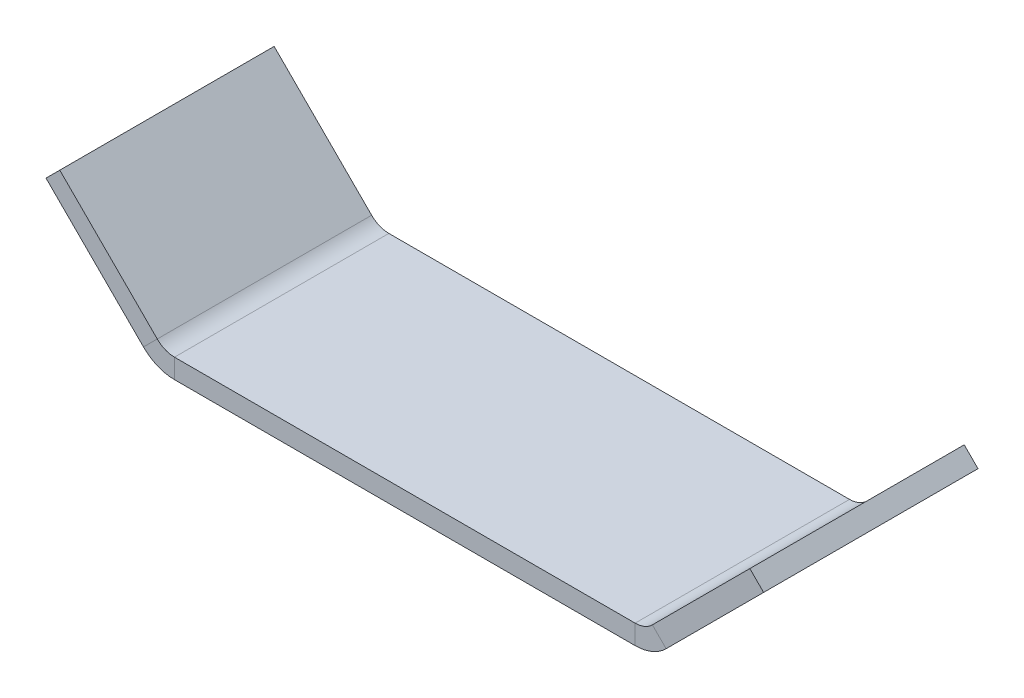
ISO-10303-21;
HEADER;
FILE_DESCRIPTION(('STEP AP214'),'2;1');
FILE_NAME('part.step','',(''),(''),'','','');
FILE_SCHEMA(('AUTOMOTIVE_DESIGN { 1 0 10303 214 1 1 1 1 }'));
ENDSEC;
DATA;
#1=APPLICATION_CONTEXT('core data for automotive mechanical design processes');
#2=APPLICATION_PROTOCOL_DEFINITION('international standard','automotive_design',2000,#1);
#3=PRODUCT_CONTEXT('',#1,'mechanical');
#4=PRODUCT('Part','Part','',(#3));
#5=PRODUCT_RELATED_PRODUCT_CATEGORY('part','',(#4));
#6=PRODUCT_DEFINITION_FORMATION('','',#4);
#7=PRODUCT_DEFINITION_CONTEXT('part definition',#1,'design');
#8=PRODUCT_DEFINITION('design','',#6,#7);
#9=PRODUCT_DEFINITION_SHAPE('','',#8);
#10=(LENGTH_UNIT() NAMED_UNIT(*) SI_UNIT(.MILLI.,.METRE.));
#11=(NAMED_UNIT(*) PLANE_ANGLE_UNIT() SI_UNIT($,.RADIAN.));
#12=(NAMED_UNIT(*) SI_UNIT($,.STERADIAN.) SOLID_ANGLE_UNIT());
#13=UNCERTAINTY_MEASURE_WITH_UNIT(LENGTH_MEASURE(1.E-05),#10,'distance_accuracy_value','');
#14=(GEOMETRIC_REPRESENTATION_CONTEXT(3) GLOBAL_UNCERTAINTY_ASSIGNED_CONTEXT((#13)) GLOBAL_UNIT_ASSIGNED_CONTEXT((#10,
#11,#12)) REPRESENTATION_CONTEXT('',''));
#15=CARTESIAN_POINT('',(0.,0.,0.));
#16=DIRECTION('',(0.,0.,1.));
#17=DIRECTION('',(1.,0.,0.));
#18=AXIS2_PLACEMENT_3D('',#15,#16,#17);
#19=CARTESIAN_POINT('',(-12.0080164940175,0.,11.176));
#20=DIRECTION('',(0.,0.,1.));
#21=DIRECTION('',(1.,0.,0.));
#22=AXIS2_PLACEMENT_3D('',#19,#20,#21);
#23=PLANE('',#22);
#24=DIRECTION('',(0.,-1.,0.));
#25=VECTOR('',#24,1.);
#26=CARTESIAN_POINT('',(-12.0080164940175,0.,11.176));
#27=LINE('',#26,#25);
#28=CARTESIAN_POINT('',(-12.0080164940175,0.,11.176));
#29=VERTEX_POINT('',#28);
#30=CARTESIAN_POINT('',(-12.0080164940175,-1.016,11.176));
#31=VERTEX_POINT('',#30);
#32=EDGE_CURVE('E11',#29,#31,#27,.T.);
#33=ORIENTED_EDGE('',*,*,#32,.F.);
#34=CARTESIAN_POINT('',(-12.0080164940175,1.27,11.176));
#35=DIRECTION('',(0.,0.,-1.));
#36=DIRECTION('',(-1.,0.,0.));
#37=AXIS2_PLACEMENT_3D('',#34,#35,#36);
#38=CIRCLE('',#37,1.27);
#39=CARTESIAN_POINT('',(-12.9060421061244,0.371974387893083,11.176));
#40=VERTEX_POINT('',#39);
#41=EDGE_CURVE('E249',#40,#29,#38,.F.);
#42=ORIENTED_EDGE('',*,*,#41,.F.);
#43=DIRECTION('',(0.707106781186547,0.707106781186548,0.));
#44=VECTOR('',#43,1.);
#45=CARTESIAN_POINT('',(-13.62446259581,-0.346446101792449,11.176));
#46=LINE('',#45,#44);
#47=CARTESIAN_POINT('',(-13.62446259581,-0.346446101792449,11.176));
#48=VERTEX_POINT('',#47);
#49=EDGE_CURVE('E47',#48,#40,#46,.T.);
#50=ORIENTED_EDGE('',*,*,#49,.F.);
#51=CARTESIAN_POINT('',(-12.0080164940175,1.27,11.176));
#52=DIRECTION('',(0.,0.,1.));
#53=DIRECTION('',(1.,0.,0.));
#54=AXIS2_PLACEMENT_3D('',#51,#52,#53);
#55=CIRCLE('',#54,2.286);
#56=EDGE_CURVE('E148',#48,#31,#55,.T.);
#57=ORIENTED_EDGE('',*,*,#56,.T.);
#58=EDGE_LOOP('',(#33,#42,#50,#57));
#59=FACE_BOUND('',#58,.T.);
#60=ADVANCED_FACE('F39',(#59),#23,.T.);
#61=CARTESIAN_POINT('',(-13.62446259581,-0.346446101792449,11.176));
#62=DIRECTION('',(0.,0.,1.));
#63=DIRECTION('',(1.,0.,0.));
#64=AXIS2_PLACEMENT_3D('',#61,#62,#63);
#65=PLANE('',#64);
#66=DIRECTION('',(1.,0.,0.));
#67=VECTOR('',#66,1.);
#68=CARTESIAN_POINT('',(-12.5340677182313,0.,11.176));
#69=LINE('',#68,#67);
#70=CARTESIAN_POINT('',(12.0080164940175,0.,11.176));
#71=VERTEX_POINT('',#70);
#72=EDGE_CURVE('E142',#29,#71,#69,.T.);
#73=ORIENTED_EDGE('',*,*,#72,.F.);
#74=ORIENTED_EDGE('',*,*,#32,.T.);
#75=DIRECTION('',(1.,0.,0.));
#76=VECTOR('',#75,1.);
#77=CARTESIAN_POINT('',(-12.5340677182313,-1.016,11.176));
#78=LINE('',#77,#76);
#79=CARTESIAN_POINT('',(12.0080164940175,-1.016,11.176));
#80=VERTEX_POINT('',#79);
#81=EDGE_CURVE('E139',#31,#80,#78,.T.);
#82=ORIENTED_EDGE('',*,*,#81,.T.);
#83=DIRECTION('',(0.,1.,0.));
#84=VECTOR('',#83,1.);
#85=CARTESIAN_POINT('',(12.0080164940175,-1.016,11.176));
#86=LINE('',#85,#84);
#87=EDGE_CURVE('E230',#80,#71,#86,.T.);
#88=ORIENTED_EDGE('',*,*,#87,.T.);
#89=EDGE_LOOP('',(#73,#74,#82,#88));
#90=FACE_BOUND('',#89,.T.);
#91=ADVANCED_FACE('F137',(#90),#65,.T.);
#92=CARTESIAN_POINT('',(-12.9060421061244,0.371974387893083,0.));
#93=DIRECTION('',(0.,0.,-1.));
#94=DIRECTION('',(-1.,0.,0.));
#95=AXIS2_PLACEMENT_3D('',#92,#93,#94);
#96=PLANE('',#95);
#97=DIRECTION('',(-0.707106781186547,-0.707106781186548,0.));
#98=VECTOR('',#97,1.);
#99=CARTESIAN_POINT('',(-12.9060421061244,0.371974387893083,0.));
#100=LINE('',#99,#98);
#101=CARTESIAN_POINT('',(-12.9060421061244,0.371974387893083,0.));
#102=VERTEX_POINT('',#101);
#103=CARTESIAN_POINT('',(-13.62446259581,-0.346446101792449,0.));
#104=VERTEX_POINT('',#103);
#105=EDGE_CURVE('E235',#102,#104,#100,.T.);
#106=ORIENTED_EDGE('',*,*,#105,.F.);
#107=CARTESIAN_POINT('',(-12.0080164940175,1.27,0.));
#108=DIRECTION('',(0.,0.,-1.));
#109=DIRECTION('',(-1.,0.,0.));
#110=AXIS2_PLACEMENT_3D('',#107,#108,#109);
#111=CIRCLE('',#110,1.27);
#112=CARTESIAN_POINT('',(-12.0080164940175,0.,0.));
#113=VERTEX_POINT('',#112);
#114=EDGE_CURVE('E187',#102,#113,#111,.F.);
#115=ORIENTED_EDGE('',*,*,#114,.T.);
#116=DIRECTION('',(0.,1.,0.));
#117=VECTOR('',#116,1.);
#118=CARTESIAN_POINT('',(-12.0080164940175,-1.016,0.));
#119=LINE('',#118,#117);
#120=CARTESIAN_POINT('',(-12.0080164940175,-1.016,0.));
#121=VERTEX_POINT('',#120);
#122=EDGE_CURVE('E233',#121,#113,#119,.T.);
#123=ORIENTED_EDGE('',*,*,#122,.F.);
#124=CARTESIAN_POINT('',(-12.0080164940175,1.27,0.));
#125=DIRECTION('',(0.,0.,1.));
#126=DIRECTION('',(1.,0.,0.));
#127=AXIS2_PLACEMENT_3D('',#124,#125,#126);
#128=CIRCLE('',#127,2.286);
#129=EDGE_CURVE('E160',#104,#121,#128,.T.);
#130=ORIENTED_EDGE('',*,*,#129,.F.);
#131=EDGE_LOOP('',(#106,#115,#123,#130));
#132=FACE_BOUND('',#131,.T.);
#133=ADVANCED_FACE('F287',(#132),#96,.T.);
#134=CARTESIAN_POINT('',(-12.0080164940175,-1.016,0.));
#135=DIRECTION('',(0.,0.,-1.));
#136=DIRECTION('',(-1.,0.,0.));
#137=AXIS2_PLACEMENT_3D('',#134,#135,#136);
#138=PLANE('',#137);
#139=DIRECTION('',(0.707106781186549,-0.707106781186546,0.));
#140=VECTOR('',#139,1.);
#141=CARTESIAN_POINT('',(-12.5340677182313,0.,0.));
#142=LINE('',#141,#140);
#143=CARTESIAN_POINT('',(-17.9878223742557,5.45375465602433,0.));
#144=VERTEX_POINT('',#143);
#145=EDGE_CURVE('E190',#144,#102,#142,.T.);
#146=ORIENTED_EDGE('',*,*,#145,.T.);
#147=ORIENTED_EDGE('',*,*,#105,.T.);
#148=DIRECTION('',(0.707106781186549,-0.707106781186546,0.));
#149=VECTOR('',#148,1.);
#150=CARTESIAN_POINT('',(-13.2524882079169,-0.718420489685533,0.));
#151=LINE('',#150,#149);
#152=CARTESIAN_POINT('',(-18.7062428639412,4.7353341663388,0.));
#153=VERTEX_POINT('',#152);
#154=EDGE_CURVE('E196',#153,#104,#151,.T.);
#155=ORIENTED_EDGE('',*,*,#154,.F.);
#156=DIRECTION('',(0.707106781186548,0.707106781186548,0.));
#157=VECTOR('',#156,1.);
#158=CARTESIAN_POINT('',(-18.7062428639412,4.7353341663388,0.));
#159=LINE('',#158,#157);
#160=EDGE_CURVE('E193',#153,#144,#159,.T.);
#161=ORIENTED_EDGE('',*,*,#160,.T.);
#162=EDGE_LOOP('',(#146,#147,#155,#161));
#163=FACE_BOUND('',#162,.T.);
#164=ADVANCED_FACE('F290',(#163),#138,.T.);
#165=CARTESIAN_POINT('',(12.9060421061244,0.371974387893082,11.176));
#166=DIRECTION('',(0.,0.,1.));
#167=DIRECTION('',(1.,0.,0.));
#168=AXIS2_PLACEMENT_3D('',#165,#166,#167);
#169=PLANE('',#168);
#170=DIRECTION('',(0.707106781186548,-0.707106781186547,0.));
#171=VECTOR('',#170,1.);
#172=CARTESIAN_POINT('',(12.9060421061244,0.371974387893082,11.176));
#173=LINE('',#172,#171);
#174=CARTESIAN_POINT('',(12.9060421061244,0.371974387893082,11.176));
#175=VERTEX_POINT('',#174);
#176=CARTESIAN_POINT('',(13.62446259581,-0.346446101792449,11.176));
#177=VERTEX_POINT('',#176);
#178=EDGE_CURVE('E55',#175,#177,#173,.T.);
#179=ORIENTED_EDGE('',*,*,#178,.F.);
#180=CARTESIAN_POINT('',(12.0080164940175,1.27,11.176));
#181=DIRECTION('',(0.,0.,-1.));
#182=DIRECTION('',(-1.,0.,0.));
#183=AXIS2_PLACEMENT_3D('',#180,#181,#182);
#184=CIRCLE('',#183,1.27);
#185=EDGE_CURVE('E259',#71,#175,#184,.F.);
#186=ORIENTED_EDGE('',*,*,#185,.F.);
#187=ORIENTED_EDGE('',*,*,#87,.F.);
#188=CARTESIAN_POINT('',(12.0080164940175,1.27,11.176));
#189=DIRECTION('',(0.,0.,1.));
#190=DIRECTION('',(1.,0.,0.));
#191=AXIS2_PLACEMENT_3D('',#188,#189,#190);
#192=CIRCLE('',#191,2.286);
#193=EDGE_CURVE('E168',#80,#177,#192,.T.);
#194=ORIENTED_EDGE('',*,*,#193,.T.);
#195=EDGE_LOOP('',(#179,#186,#187,#194));
#196=FACE_BOUND('',#195,.T.);
#197=ADVANCED_FACE('F282',(#196),#169,.T.);
#198=CARTESIAN_POINT('',(12.0080164940175,-1.016,11.176));
#199=DIRECTION('',(0.,0.,1.));
#200=DIRECTION('',(1.,0.,0.));
#201=AXIS2_PLACEMENT_3D('',#198,#199,#200);
#202=PLANE('',#201);
#203=DIRECTION('',(0.707106781186546,0.707106781186549,0.));
#204=VECTOR('',#203,1.);
#205=CARTESIAN_POINT('',(12.5340677182313,0.,11.176));
#206=LINE('',#205,#204);
#207=CARTESIAN_POINT('',(17.9878223742557,5.45375465602433,11.176));
#208=VERTEX_POINT('',#207);
#209=EDGE_CURVE('E262',#175,#208,#206,.T.);
#210=ORIENTED_EDGE('',*,*,#209,.F.);
#211=ORIENTED_EDGE('',*,*,#178,.T.);
#212=DIRECTION('',(0.707106781186546,0.707106781186549,0.));
#213=VECTOR('',#212,1.);
#214=CARTESIAN_POINT('',(13.2524882079169,-0.718420489685531,11.176));
#215=LINE('',#214,#213);
#216=CARTESIAN_POINT('',(18.7062428639412,4.7353341663388,11.176));
#217=VERTEX_POINT('',#216);
#218=EDGE_CURVE('E109',#177,#217,#215,.T.);
#219=ORIENTED_EDGE('',*,*,#218,.T.);
#220=DIRECTION('',(0.707106781186549,-0.707106781186546,0.));
#221=VECTOR('',#220,1.);
#222=CARTESIAN_POINT('',(17.9878223742557,5.45375465602433,11.176));
#223=LINE('',#222,#221);
#224=EDGE_CURVE('E265',#208,#217,#223,.T.);
#225=ORIENTED_EDGE('',*,*,#224,.F.);
#226=EDGE_LOOP('',(#210,#211,#219,#225));
#227=FACE_BOUND('',#226,.T.);
#228=ADVANCED_FACE('F271',(#227),#202,.T.);
#229=CARTESIAN_POINT('',(12.0080164940175,0.,0.));
#230=DIRECTION('',(0.,0.,-1.));
#231=DIRECTION('',(-1.,0.,0.));
#232=AXIS2_PLACEMENT_3D('',#229,#230,#231);
#233=PLANE('',#232);
#234=DIRECTION('',(0.,-1.,0.));
#235=VECTOR('',#234,1.);
#236=CARTESIAN_POINT('',(12.0080164940175,0.,0.));
#237=LINE('',#236,#235);
#238=CARTESIAN_POINT('',(12.0080164940175,0.,0.));
#239=VERTEX_POINT('',#238);
#240=CARTESIAN_POINT('',(12.0080164940175,-1.016,0.));
#241=VERTEX_POINT('',#240);
#242=EDGE_CURVE('E96',#239,#241,#237,.T.);
#243=ORIENTED_EDGE('',*,*,#242,.F.);
#244=CARTESIAN_POINT('',(12.0080164940175,1.27,0.));
#245=DIRECTION('',(0.,0.,-1.));
#246=DIRECTION('',(-1.,0.,0.));
#247=AXIS2_PLACEMENT_3D('',#244,#245,#246);
#248=CIRCLE('',#247,1.27);
#249=CARTESIAN_POINT('',(12.9060421061244,0.371974387893082,0.));
#250=VERTEX_POINT('',#249);
#251=EDGE_CURVE('E183',#239,#250,#248,.F.);
#252=ORIENTED_EDGE('',*,*,#251,.T.);
#253=DIRECTION('',(-0.707106781186548,0.707106781186547,0.));
#254=VECTOR('',#253,1.);
#255=CARTESIAN_POINT('',(13.62446259581,-0.346446101792449,0.));
#256=LINE('',#255,#254);
#257=CARTESIAN_POINT('',(13.62446259581,-0.346446101792449,0.));
#258=VERTEX_POINT('',#257);
#259=EDGE_CURVE('E103',#258,#250,#256,.T.);
#260=ORIENTED_EDGE('',*,*,#259,.F.);
#261=CARTESIAN_POINT('',(12.0080164940175,1.27,0.));
#262=DIRECTION('',(0.,0.,1.));
#263=DIRECTION('',(1.,0.,0.));
#264=AXIS2_PLACEMENT_3D('',#261,#262,#263);
#265=CIRCLE('',#264,2.286);
#266=EDGE_CURVE('E202',#241,#258,#265,.T.);
#267=ORIENTED_EDGE('',*,*,#266,.F.);
#268=EDGE_LOOP('',(#243,#252,#260,#267));
#269=FACE_BOUND('',#268,.T.);
#270=ADVANCED_FACE('F319',(#269),#233,.T.);
#271=CARTESIAN_POINT('',(13.62446259581,-0.346446101792449,0.));
#272=DIRECTION('',(0.,0.,-1.));
#273=DIRECTION('',(-1.,0.,0.));
#274=AXIS2_PLACEMENT_3D('',#271,#272,#273);
#275=PLANE('',#274);
#276=DIRECTION('',(1.,0.,0.));
#277=VECTOR('',#276,1.);
#278=CARTESIAN_POINT('',(-12.5340677182313,0.,0.));
#279=LINE('',#278,#277);
#280=EDGE_CURVE('E185',#113,#239,#279,.T.);
#281=ORIENTED_EDGE('',*,*,#280,.T.);
#282=ORIENTED_EDGE('',*,*,#242,.T.);
#283=DIRECTION('',(1.,0.,0.));
#284=VECTOR('',#283,1.);
#285=CARTESIAN_POINT('',(-12.5340677182313,-1.016,0.));
#286=LINE('',#285,#284);
#287=EDGE_CURVE('E200',#121,#241,#286,.T.);
#288=ORIENTED_EDGE('',*,*,#287,.F.);
#289=ORIENTED_EDGE('',*,*,#122,.T.);
#290=EDGE_LOOP('',(#281,#282,#288,#289));
#291=FACE_BOUND('',#290,.T.);
#292=ADVANCED_FACE('F322',(#291),#275,.T.);
#293=CARTESIAN_POINT('',(13.2524882079169,-0.718420489685531,11.176));
#294=DIRECTION('',(-0.707106781186549,0.707106781186546,0.));
#295=DIRECTION('',(-0.707106781186546,-0.707106781186549,0.));
#296=AXIS2_PLACEMENT_3D('',#293,#294,#295);
#297=PLANE('',#296);
#298=DIRECTION('',(0.707106781186546,0.707106781186549,0.));
#299=VECTOR('',#298,1.);
#300=CARTESIAN_POINT('',(13.2524882079169,-0.718420489685531,0.));
#301=LINE('',#300,#299);
#302=CARTESIAN_POINT('',(18.7062428639412,4.7353341663388,0.));
#303=VERTEX_POINT('',#302);
#304=EDGE_CURVE('E174',#258,#303,#301,.T.);
#305=ORIENTED_EDGE('',*,*,#304,.T.);
#306=DIRECTION('',(0.,0.,-1.));
#307=VECTOR('',#306,1.);
#308=CARTESIAN_POINT('',(18.7062428639412,4.7353341663388,11.176));
#309=LINE('',#308,#307);
#310=EDGE_CURVE('E226',#217,#303,#309,.T.);
#311=ORIENTED_EDGE('',*,*,#310,.F.);
#312=ORIENTED_EDGE('',*,*,#218,.F.);
#313=DIRECTION('',(0.,0.,-1.));
#314=VECTOR('',#313,1.);
#315=CARTESIAN_POINT('',(13.62446259581,-0.346446101792449,11.176));
#316=LINE('',#315,#314);
#317=EDGE_CURVE('E170',#177,#258,#316,.T.);
#318=ORIENTED_EDGE('',*,*,#317,.T.);
#319=EDGE_LOOP('',(#305,#311,#312,#318));
#320=FACE_BOUND('',#319,.T.);
#321=ADVANCED_FACE('F325',(#320),#297,.F.);
#322=CARTESIAN_POINT('',(17.9878223742557,5.45375465602433,11.176));
#323=DIRECTION('',(0.707106781186546,0.707106781186549,0.));
#324=DIRECTION('',(-0.707106781186549,0.707106781186546,0.));
#325=AXIS2_PLACEMENT_3D('',#322,#323,#324);
#326=PLANE('',#325);
#327=DIRECTION('',(0.707106781186549,-0.707106781186546,0.));
#328=VECTOR('',#327,1.);
#329=CARTESIAN_POINT('',(17.9878223742557,5.45375465602433,0.));
#330=LINE('',#329,#328);
#331=CARTESIAN_POINT('',(17.9878223742557,5.45375465602433,0.));
#332=VERTEX_POINT('',#331);
#333=EDGE_CURVE('E177',#332,#303,#330,.T.);
#334=ORIENTED_EDGE('',*,*,#333,.F.);
#335=DIRECTION('',(0.,0.,-1.));
#336=VECTOR('',#335,1.);
#337=CARTESIAN_POINT('',(17.9878223742557,5.45375465602433,11.176));
#338=LINE('',#337,#336);
#339=EDGE_CURVE('E224',#208,#332,#338,.T.);
#340=ORIENTED_EDGE('',*,*,#339,.F.);
#341=ORIENTED_EDGE('',*,*,#224,.T.);
#342=ORIENTED_EDGE('',*,*,#310,.T.);
#343=EDGE_LOOP('',(#334,#340,#341,#342));
#344=FACE_BOUND('',#343,.T.);
#345=ADVANCED_FACE('F270',(#344),#326,.T.);
#346=CARTESIAN_POINT('',(12.5340677182313,0.,11.176));
#347=DIRECTION('',(-0.707106781186549,0.707106781186546,0.));
#348=DIRECTION('',(-0.707106781186546,-0.707106781186549,0.));
#349=AXIS2_PLACEMENT_3D('',#346,#347,#348);
#350=PLANE('',#349);
#351=DIRECTION('',(0.707106781186546,0.707106781186549,0.));
#352=VECTOR('',#351,1.);
#353=CARTESIAN_POINT('',(12.5340677182313,0.,0.));
#354=LINE('',#353,#352);
#355=EDGE_CURVE('E180',#250,#332,#354,.T.);
#356=ORIENTED_EDGE('',*,*,#355,.F.);
#357=DIRECTION('',(0.,0.,-1.));
#358=VECTOR('',#357,1.);
#359=CARTESIAN_POINT('',(12.9060421061244,0.371974387893082,11.176));
#360=LINE('',#359,#358);
#361=EDGE_CURVE('E221',#175,#250,#360,.T.);
#362=ORIENTED_EDGE('',*,*,#361,.F.);
#363=ORIENTED_EDGE('',*,*,#209,.T.);
#364=ORIENTED_EDGE('',*,*,#339,.T.);
#365=EDGE_LOOP('',(#356,#362,#363,#364));
#366=FACE_BOUND('',#365,.T.);
#367=ADVANCED_FACE('F275',(#366),#350,.T.);
#368=CARTESIAN_POINT('',(12.0080164940175,1.27,11.176));
#369=DIRECTION('',(0.,0.,-1.));
#370=DIRECTION('',(-1.,0.,0.));
#371=AXIS2_PLACEMENT_3D('',#368,#369,#370);
#372=CYLINDRICAL_SURFACE('',#371,1.27);
#373=ORIENTED_EDGE('',*,*,#251,.F.);
#374=DIRECTION('',(0.,0.,-1.));
#375=VECTOR('',#374,1.);
#376=CARTESIAN_POINT('',(12.0080164940175,0.,11.176));
#377=LINE('',#376,#375);
#378=EDGE_CURVE('E218',#71,#239,#377,.T.);
#379=ORIENTED_EDGE('',*,*,#378,.F.);
#380=ORIENTED_EDGE('',*,*,#185,.T.);
#381=ORIENTED_EDGE('',*,*,#361,.T.);
#382=EDGE_LOOP('',(#373,#379,#380,#381));
#383=FACE_BOUND('',#382,.T.);
#384=ADVANCED_FACE('F278',(#383),#372,.F.);
#385=CARTESIAN_POINT('',(-12.5340677182313,0.,11.176));
#386=DIRECTION('',(0.,1.,0.));
#387=DIRECTION('',(0.,0.,1.));
#388=AXIS2_PLACEMENT_3D('',#385,#386,#387);
#389=PLANE('',#388);
#390=ORIENTED_EDGE('',*,*,#280,.F.);
#391=DIRECTION('',(0.,0.,-1.));
#392=VECTOR('',#391,1.);
#393=CARTESIAN_POINT('',(-12.0080164940175,0.,11.176));
#394=LINE('',#393,#392);
#395=EDGE_CURVE('E215',#29,#113,#394,.T.);
#396=ORIENTED_EDGE('',*,*,#395,.F.);
#397=ORIENTED_EDGE('',*,*,#72,.T.);
#398=ORIENTED_EDGE('',*,*,#378,.T.);
#399=EDGE_LOOP('',(#390,#396,#397,#398));
#400=FACE_BOUND('',#399,.T.);
#401=ADVANCED_FACE('F285',(#400),#389,.T.);
#402=CARTESIAN_POINT('',(-12.0080164940175,1.27,11.176));
#403=DIRECTION('',(0.,0.,-1.));
#404=DIRECTION('',(-1.,0.,0.));
#405=AXIS2_PLACEMENT_3D('',#402,#403,#404);
#406=CYLINDRICAL_SURFACE('',#405,1.27);
#407=ORIENTED_EDGE('',*,*,#114,.F.);
#408=DIRECTION('',(0.,0.,-1.));
#409=VECTOR('',#408,1.);
#410=CARTESIAN_POINT('',(-12.9060421061244,0.371974387893083,11.176));
#411=LINE('',#410,#409);
#412=EDGE_CURVE('E212',#40,#102,#411,.T.);
#413=ORIENTED_EDGE('',*,*,#412,.F.);
#414=ORIENTED_EDGE('',*,*,#41,.T.);
#415=ORIENTED_EDGE('',*,*,#395,.T.);
#416=EDGE_LOOP('',(#407,#413,#414,#415));
#417=FACE_BOUND('',#416,.T.);
#418=ADVANCED_FACE('F248',(#417),#406,.F.);
#419=CARTESIAN_POINT('',(-12.5340677182313,0.,11.176));
#420=DIRECTION('',(0.707106781186547,0.707106781186549,0.));
#421=DIRECTION('',(-0.707106781186549,0.707106781186546,0.));
#422=AXIS2_PLACEMENT_3D('',#419,#420,#421);
#423=PLANE('',#422);
#424=ORIENTED_EDGE('',*,*,#145,.F.);
#425=DIRECTION('',(0.,0.,-1.));
#426=VECTOR('',#425,1.);
#427=CARTESIAN_POINT('',(-17.9878223742557,5.45375465602433,11.176));
#428=LINE('',#427,#426);
#429=CARTESIAN_POINT('',(-17.9878223742557,5.45375465602433,11.176));
#430=VERTEX_POINT('',#429);
#431=EDGE_CURVE('E210',#430,#144,#428,.T.);
#432=ORIENTED_EDGE('',*,*,#431,.F.);
#433=DIRECTION('',(0.707106781186549,-0.707106781186546,0.));
#434=VECTOR('',#433,1.);
#435=CARTESIAN_POINT('',(-12.5340677182313,0.,11.176));
#436=LINE('',#435,#434);
#437=EDGE_CURVE('E242',#430,#40,#436,.T.);
#438=ORIENTED_EDGE('',*,*,#437,.T.);
#439=ORIENTED_EDGE('',*,*,#412,.T.);
#440=EDGE_LOOP('',(#424,#432,#438,#439));
#441=FACE_BOUND('',#440,.T.);
#442=ADVANCED_FACE('F253',(#441),#423,.T.);
#443=CARTESIAN_POINT('',(-18.7062428639412,4.7353341663388,11.176));
#444=DIRECTION('',(-0.707106781186548,0.707106781186548,0.));
#445=DIRECTION('',(-0.707106781186548,-0.707106781186548,0.));
#446=AXIS2_PLACEMENT_3D('',#443,#444,#445);
#447=PLANE('',#446);
#448=ORIENTED_EDGE('',*,*,#160,.F.);
#449=DIRECTION('',(0.,0.,-1.));
#450=VECTOR('',#449,1.);
#451=CARTESIAN_POINT('',(-18.7062428639412,4.7353341663388,11.176));
#452=LINE('',#451,#450);
#453=CARTESIAN_POINT('',(-18.7062428639412,4.7353341663388,11.176));
#454=VERTEX_POINT('',#453);
#455=EDGE_CURVE('E208',#454,#153,#452,.T.);
#456=ORIENTED_EDGE('',*,*,#455,.F.);
#457=DIRECTION('',(0.707106781186548,0.707106781186548,0.));
#458=VECTOR('',#457,1.);
#459=CARTESIAN_POINT('',(-18.7062428639412,4.7353341663388,11.176));
#460=LINE('',#459,#458);
#461=EDGE_CURVE('E254',#454,#430,#460,.T.);
#462=ORIENTED_EDGE('',*,*,#461,.T.);
#463=ORIENTED_EDGE('',*,*,#431,.T.);
#464=EDGE_LOOP('',(#448,#456,#462,#463));
#465=FACE_BOUND('',#464,.T.);
#466=ADVANCED_FACE('F295',(#465),#447,.T.);
#467=CARTESIAN_POINT('',(-13.2524882079169,-0.718420489685533,11.176));
#468=DIRECTION('',(0.707106781186546,0.707106781186549,0.));
#469=DIRECTION('',(-0.707106781186549,0.707106781186546,0.));
#470=AXIS2_PLACEMENT_3D('',#467,#468,#469);
#471=PLANE('',#470);
#472=ORIENTED_EDGE('',*,*,#154,.T.);
#473=DIRECTION('',(0.,0.,-1.));
#474=VECTOR('',#473,1.);
#475=CARTESIAN_POINT('',(-13.62446259581,-0.346446101792449,11.176));
#476=LINE('',#475,#474);
#477=EDGE_CURVE('E162',#48,#104,#476,.T.);
#478=ORIENTED_EDGE('',*,*,#477,.F.);
#479=DIRECTION('',(0.707106781186549,-0.707106781186546,0.));
#480=VECTOR('',#479,1.);
#481=CARTESIAN_POINT('',(-13.2524882079169,-0.718420489685533,11.176));
#482=LINE('',#481,#480);
#483=EDGE_CURVE('E153',#454,#48,#482,.T.);
#484=ORIENTED_EDGE('',*,*,#483,.F.);
#485=ORIENTED_EDGE('',*,*,#455,.T.);
#486=EDGE_LOOP('',(#472,#478,#484,#485));
#487=FACE_BOUND('',#486,.T.);
#488=ADVANCED_FACE('F293',(#487),#471,.F.);
#489=CARTESIAN_POINT('',(-12.0080164940175,1.27,11.176));
#490=DIRECTION('',(0.,0.,-1.));
#491=DIRECTION('',(-1.,0.,0.));
#492=AXIS2_PLACEMENT_3D('',#489,#490,#491);
#493=CYLINDRICAL_SURFACE('',#492,2.286);
#494=ORIENTED_EDGE('',*,*,#129,.T.);
#495=DIRECTION('',(0.,0.,-1.));
#496=VECTOR('',#495,1.);
#497=CARTESIAN_POINT('',(-12.0080164940175,-1.016,11.176));
#498=LINE('',#497,#496);
#499=EDGE_CURVE('E157',#31,#121,#498,.T.);
#500=ORIENTED_EDGE('',*,*,#499,.F.);
#501=ORIENTED_EDGE('',*,*,#56,.F.);
#502=ORIENTED_EDGE('',*,*,#477,.T.);
#503=EDGE_LOOP('',(#494,#500,#501,#502));
#504=FACE_BOUND('',#503,.T.);
#505=ADVANCED_FACE('F158',(#504),#493,.T.);
#506=CARTESIAN_POINT('',(-12.5340677182313,-1.016,11.176));
#507=DIRECTION('',(0.,1.,0.));
#508=DIRECTION('',(0.,0.,1.));
#509=AXIS2_PLACEMENT_3D('',#506,#507,#508);
#510=PLANE('',#509);
#511=ORIENTED_EDGE('',*,*,#287,.T.);
#512=DIRECTION('',(0.,0.,-1.));
#513=VECTOR('',#512,1.);
#514=CARTESIAN_POINT('',(12.0080164940175,-1.016,11.176));
#515=LINE('',#514,#513);
#516=EDGE_CURVE('E163',#80,#241,#515,.T.);
#517=ORIENTED_EDGE('',*,*,#516,.F.);
#518=ORIENTED_EDGE('',*,*,#81,.F.);
#519=ORIENTED_EDGE('',*,*,#499,.T.);
#520=EDGE_LOOP('',(#511,#517,#518,#519));
#521=FACE_BOUND('',#520,.T.);
#522=ADVANCED_FACE('F165',(#521),#510,.F.);
#523=CARTESIAN_POINT('',(12.0080164940175,1.27,11.176));
#524=DIRECTION('',(0.,0.,-1.));
#525=DIRECTION('',(-1.,0.,0.));
#526=AXIS2_PLACEMENT_3D('',#523,#524,#525);
#527=CYLINDRICAL_SURFACE('',#526,2.286);
#528=ORIENTED_EDGE('',*,*,#266,.T.);
#529=ORIENTED_EDGE('',*,*,#317,.F.);
#530=ORIENTED_EDGE('',*,*,#193,.F.);
#531=ORIENTED_EDGE('',*,*,#516,.T.);
#532=EDGE_LOOP('',(#528,#529,#530,#531));
#533=FACE_BOUND('',#532,.T.);
#534=ADVANCED_FACE('F377',(#533),#527,.T.);
#535=CARTESIAN_POINT('',(12.0080164940175,1.27,11.176));
#536=DIRECTION('',(0.,0.,-1.));
#537=DIRECTION('',(-1.,0.,0.));
#538=AXIS2_PLACEMENT_3D('',#535,#536,#537);
#539=PLANE('',#538);
#540=ORIENTED_EDGE('',*,*,#483,.T.);
#541=ORIENTED_EDGE('',*,*,#49,.T.);
#542=ORIENTED_EDGE('',*,*,#437,.F.);
#543=ORIENTED_EDGE('',*,*,#461,.F.);
#544=EDGE_LOOP('',(#540,#541,#542,#543));
#545=FACE_BOUND('',#544,.T.);
#546=ADVANCED_FACE('F239',(#545),#539,.F.);
#547=CARTESIAN_POINT('',(12.0080164940175,1.27,0.));
#548=DIRECTION('',(0.,0.,-1.));
#549=DIRECTION('',(-1.,0.,0.));
#550=AXIS2_PLACEMENT_3D('',#547,#548,#549);
#551=PLANE('',#550);
#552=ORIENTED_EDGE('',*,*,#304,.F.);
#553=ORIENTED_EDGE('',*,*,#259,.T.);
#554=ORIENTED_EDGE('',*,*,#355,.T.);
#555=ORIENTED_EDGE('',*,*,#333,.T.);
#556=EDGE_LOOP('',(#552,#553,#554,#555));
#557=FACE_BOUND('',#556,.T.);
#558=ADVANCED_FACE('F397',(#557),#551,.T.);
#559=CLOSED_SHELL('',(#60,#91,#133,#164,#197,#228,#270,#292,#321,#345,#367,#384,#401,#418,#442,
#466,#488,#505,#522,#534,#546,#558));
#560=MANIFOLD_SOLID_BREP('B2',#559);
#561=ADVANCED_BREP_SHAPE_REPRESENTATION('',(#18,#560),#14);
#562=SHAPE_DEFINITION_REPRESENTATION(#9,#561);
ENDSEC;
END-ISO-10303-21;
